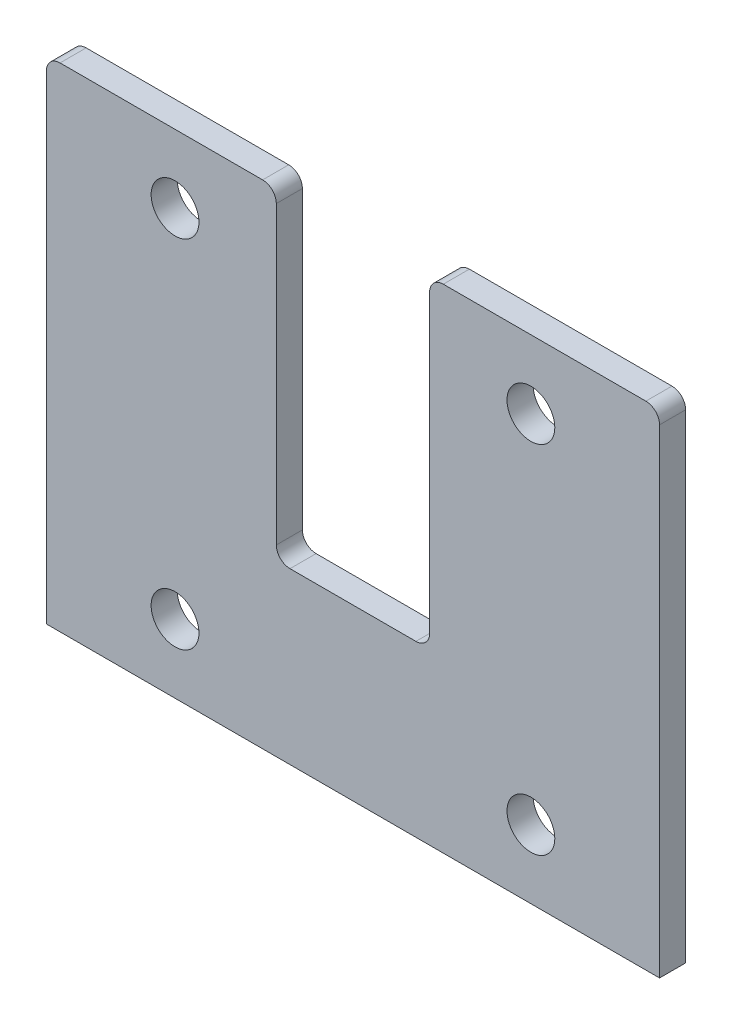
ISO-10303-21;
HEADER;
FILE_DESCRIPTION(('STEP AP214'),'2;1');
FILE_NAME('part.step','',(''),(''),'','','');
FILE_SCHEMA(('AUTOMOTIVE_DESIGN { 1 0 10303 214 1 1 1 1 }'));
ENDSEC;
DATA;
#1=APPLICATION_CONTEXT('core data for automotive mechanical design processes');
#2=APPLICATION_PROTOCOL_DEFINITION('international standard','automotive_design',2000,#1);
#3=PRODUCT_CONTEXT('',#1,'mechanical');
#4=PRODUCT('Part','Part','',(#3));
#5=PRODUCT_RELATED_PRODUCT_CATEGORY('part','',(#4));
#6=PRODUCT_DEFINITION_FORMATION('','',#4);
#7=PRODUCT_DEFINITION_CONTEXT('part definition',#1,'design');
#8=PRODUCT_DEFINITION('design','',#6,#7);
#9=PRODUCT_DEFINITION_SHAPE('','',#8);
#10=(LENGTH_UNIT() NAMED_UNIT(*) SI_UNIT(.MILLI.,.METRE.));
#11=(NAMED_UNIT(*) PLANE_ANGLE_UNIT() SI_UNIT($,.RADIAN.));
#12=(NAMED_UNIT(*) SI_UNIT($,.STERADIAN.) SOLID_ANGLE_UNIT());
#13=UNCERTAINTY_MEASURE_WITH_UNIT(LENGTH_MEASURE(1.E-05),#10,'distance_accuracy_value','');
#14=(GEOMETRIC_REPRESENTATION_CONTEXT(3) GLOBAL_UNCERTAINTY_ASSIGNED_CONTEXT((#13)) GLOBAL_UNIT_ASSIGNED_CONTEXT((#10,
#11,#12)) REPRESENTATION_CONTEXT('',''));
#15=CARTESIAN_POINT('',(0.,0.,0.));
#16=DIRECTION('',(0.,0.,1.));
#17=DIRECTION('',(1.,0.,0.));
#18=AXIS2_PLACEMENT_3D('',#15,#16,#17);
#19=CARTESIAN_POINT('',(0.,0.,9.525));
#20=DIRECTION('',(0.,-1.,0.));
#21=DIRECTION('',(0.,0.,-1.));
#22=AXIS2_PLACEMENT_3D('',#19,#20,#21);
#23=PLANE('',#22);
#24=DIRECTION('',(-1.,0.,0.));
#25=VECTOR('',#24,1.);
#26=CARTESIAN_POINT('',(0.,0.,0.));
#27=LINE('',#26,#25);
#28=CARTESIAN_POINT('',(219.,0.,0.));
#29=VERTEX_POINT('',#28);
#30=CARTESIAN_POINT('',(145.,0.,0.));
#31=VERTEX_POINT('',#30);
#32=EDGE_CURVE('E152',#29,#31,#27,.T.);
#33=ORIENTED_EDGE('',*,*,#32,.T.);
#34=DIRECTION('',(0.,0.,1.));
#35=VECTOR('',#34,1.);
#36=CARTESIAN_POINT('',(145.,0.,9.525));
#37=LINE('',#36,#35);
#38=CARTESIAN_POINT('',(145.,0.,9.525));
#39=VERTEX_POINT('',#38);
#40=EDGE_CURVE('E183',#31,#39,#37,.T.);
#41=ORIENTED_EDGE('',*,*,#40,.T.);
#42=DIRECTION('',(-1.,0.,0.));
#43=VECTOR('',#42,1.);
#44=CARTESIAN_POINT('',(0.,0.,9.525));
#45=LINE('',#44,#43);
#46=CARTESIAN_POINT('',(219.,0.,9.525));
#47=VERTEX_POINT('',#46);
#48=EDGE_CURVE('E171',#47,#39,#45,.T.);
#49=ORIENTED_EDGE('',*,*,#48,.F.);
#50=DIRECTION('',(0.,0.,-1.));
#51=VECTOR('',#50,1.);
#52=CARTESIAN_POINT('',(219.,0.,9.525));
#53=LINE('',#52,#51);
#54=EDGE_CURVE('E180',#47,#29,#53,.T.);
#55=ORIENTED_EDGE('',*,*,#54,.T.);
#56=EDGE_LOOP('',(#33,#41,#49,#55));
#57=FACE_BOUND('',#56,.T.);
#58=ADVANCED_FACE('F35',(#57),#23,.F.);
#59=CARTESIAN_POINT('',(0.,0.,9.525));
#60=DIRECTION('',(1.,0.,0.));
#61=DIRECTION('',(0.,1.,0.));
#62=AXIS2_PLACEMENT_3D('',#59,#60,#61);
#63=PLANE('',#62);
#64=DIRECTION('',(0.,-1.,0.));
#65=VECTOR('',#64,1.);
#66=CARTESIAN_POINT('',(0.,0.,9.525));
#67=LINE('',#66,#65);
#68=CARTESIAN_POINT('',(0.,-5.,9.525));
#69=VERTEX_POINT('',#68);
#70=CARTESIAN_POINT('',(0.,-180.,9.525));
#71=VERTEX_POINT('',#70);
#72=EDGE_CURVE('E138',#69,#71,#67,.T.);
#73=ORIENTED_EDGE('',*,*,#72,.F.);
#74=DIRECTION('',(0.,0.,-1.));
#75=VECTOR('',#74,1.);
#76=CARTESIAN_POINT('',(0.,-5.,9.525));
#77=LINE('',#76,#75);
#78=CARTESIAN_POINT('',(0.,-5.,0.));
#79=VERTEX_POINT('',#78);
#80=EDGE_CURVE('E220',#69,#79,#77,.T.);
#81=ORIENTED_EDGE('',*,*,#80,.T.);
#82=DIRECTION('',(0.,-1.,0.));
#83=VECTOR('',#82,1.);
#84=CARTESIAN_POINT('',(0.,0.,0.));
#85=LINE('',#84,#83);
#86=CARTESIAN_POINT('',(0.,-180.,0.));
#87=VERTEX_POINT('',#86);
#88=EDGE_CURVE('E165',#79,#87,#85,.T.);
#89=ORIENTED_EDGE('',*,*,#88,.T.);
#90=DIRECTION('',(0.,0.,-1.));
#91=VECTOR('',#90,1.);
#92=CARTESIAN_POINT('',(0.,-180.,9.525));
#93=LINE('',#92,#91);
#94=EDGE_CURVE('E157',#71,#87,#93,.T.);
#95=ORIENTED_EDGE('',*,*,#94,.F.);
#96=EDGE_LOOP('',(#73,#81,#89,#95));
#97=FACE_BOUND('',#96,.T.);
#98=ADVANCED_FACE('F163',(#97),#63,.F.);
#99=CARTESIAN_POINT('',(0.,-180.,9.525));
#100=DIRECTION('',(0.,1.,0.));
#101=DIRECTION('',(0.,0.,1.));
#102=AXIS2_PLACEMENT_3D('',#99,#100,#101);
#103=PLANE('',#102);
#104=DIRECTION('',(1.,0.,0.));
#105=VECTOR('',#104,1.);
#106=CARTESIAN_POINT('',(0.,-180.,0.));
#107=LINE('',#106,#105);
#108=CARTESIAN_POINT('',(224.,-180.,0.));
#109=VERTEX_POINT('',#108);
#110=EDGE_CURVE('E261',#87,#109,#107,.T.);
#111=ORIENTED_EDGE('',*,*,#110,.T.);
#112=DIRECTION('',(0.,0.,-1.));
#113=VECTOR('',#112,1.);
#114=CARTESIAN_POINT('',(224.,-180.,9.525));
#115=LINE('',#114,#113);
#116=CARTESIAN_POINT('',(224.,-180.,9.525));
#117=VERTEX_POINT('',#116);
#118=EDGE_CURVE('E159',#117,#109,#115,.T.);
#119=ORIENTED_EDGE('',*,*,#118,.F.);
#120=DIRECTION('',(1.,0.,0.));
#121=VECTOR('',#120,1.);
#122=CARTESIAN_POINT('',(0.,-180.,9.525));
#123=LINE('',#122,#121);
#124=EDGE_CURVE('E143',#71,#117,#123,.T.);
#125=ORIENTED_EDGE('',*,*,#124,.F.);
#126=ORIENTED_EDGE('',*,*,#94,.T.);
#127=EDGE_LOOP('',(#111,#119,#125,#126));
#128=FACE_BOUND('',#127,.T.);
#129=ADVANCED_FACE('F156',(#128),#103,.F.);
#130=CARTESIAN_POINT('',(224.,0.,9.525));
#131=DIRECTION('',(-1.,0.,0.));
#132=DIRECTION('',(0.,-1.,0.));
#133=AXIS2_PLACEMENT_3D('',#130,#131,#132);
#134=PLANE('',#133);
#135=DIRECTION('',(0.,1.,0.));
#136=VECTOR('',#135,1.);
#137=CARTESIAN_POINT('',(224.,0.,0.));
#138=LINE('',#137,#136);
#139=CARTESIAN_POINT('',(224.,-5.,0.));
#140=VERTEX_POINT('',#139);
#141=EDGE_CURVE('E263',#109,#140,#138,.T.);
#142=ORIENTED_EDGE('',*,*,#141,.T.);
#143=DIRECTION('',(0.,0.,-1.));
#144=VECTOR('',#143,1.);
#145=CARTESIAN_POINT('',(224.,-5.,9.525));
#146=LINE('',#145,#144);
#147=CARTESIAN_POINT('',(224.,-5.,9.525));
#148=VERTEX_POINT('',#147);
#149=EDGE_CURVE('E218',#140,#148,#146,.F.);
#150=ORIENTED_EDGE('',*,*,#149,.T.);
#151=DIRECTION('',(0.,1.,0.));
#152=VECTOR('',#151,1.);
#153=CARTESIAN_POINT('',(224.,0.,9.525));
#154=LINE('',#153,#152);
#155=EDGE_CURVE('E161',#117,#148,#154,.T.);
#156=ORIENTED_EDGE('',*,*,#155,.F.);
#157=ORIENTED_EDGE('',*,*,#118,.T.);
#158=EDGE_LOOP('',(#142,#150,#156,#157));
#159=FACE_BOUND('',#158,.T.);
#160=ADVANCED_FACE('F308',(#159),#134,.F.);
#161=CARTESIAN_POINT('',(79.,0.,9.525));
#162=VERTEX_POINT('',#161);
#163=CARTESIAN_POINT('',(5.,0.,9.525));
#164=VERTEX_POINT('',#163);
#165=EDGE_CURVE('E258',#162,#164,#45,.T.);
#166=ORIENTED_EDGE('',*,*,#165,.F.);
#167=DIRECTION('',(0.,0.,1.));
#168=VECTOR('',#167,1.);
#169=CARTESIAN_POINT('',(79.,0.,9.525));
#170=LINE('',#169,#168);
#171=CARTESIAN_POINT('',(79.,0.,0.));
#172=VERTEX_POINT('',#171);
#173=EDGE_CURVE('E211',#162,#172,#170,.F.);
#174=ORIENTED_EDGE('',*,*,#173,.T.);
#175=CARTESIAN_POINT('',(5.,0.,0.));
#176=VERTEX_POINT('',#175);
#177=EDGE_CURVE('E265',#172,#176,#27,.T.);
#178=ORIENTED_EDGE('',*,*,#177,.T.);
#179=DIRECTION('',(0.,0.,-1.));
#180=VECTOR('',#179,1.);
#181=CARTESIAN_POINT('',(5.,0.,9.525));
#182=LINE('',#181,#180);
#183=EDGE_CURVE('E209',#176,#164,#182,.F.);
#184=ORIENTED_EDGE('',*,*,#183,.T.);
#185=EDGE_LOOP('',(#166,#174,#178,#184));
#186=FACE_BOUND('',#185,.T.);
#187=ADVANCED_FACE('F303',(#186),#23,.F.);
#188=CARTESIAN_POINT('',(0.,0.,9.525));
#189=DIRECTION('',(0.,0.,1.));
#190=DIRECTION('',(1.,0.,0.));
#191=AXIS2_PLACEMENT_3D('',#188,#189,#190);
#192=PLANE('',#191);
#193=CARTESIAN_POINT('',(47.,-25.,9.525));
#194=DIRECTION('',(0.,0.,1.));
#195=DIRECTION('',(-1.,0.,0.));
#196=AXIS2_PLACEMENT_3D('',#193,#194,#195);
#197=CIRCLE('',#196,8.73125);
#198=CARTESIAN_POINT('',(55.73125,-25.,9.525));
#199=VERTEX_POINT('',#198);
#200=EDGE_CURVE('E235',#199,#199,#197,.T.);
#201=ORIENTED_EDGE('',*,*,#200,.F.);
#202=EDGE_LOOP('',(#201));
#203=FACE_BOUND('',#202,.T.);
#204=CARTESIAN_POINT('',(47.,-155.,9.525));
#205=DIRECTION('',(0.,0.,1.));
#206=DIRECTION('',(1.,0.,0.));
#207=AXIS2_PLACEMENT_3D('',#204,#205,#206);
#208=CIRCLE('',#207,8.73125);
#209=CARTESIAN_POINT('',(55.73125,-155.,9.525));
#210=VERTEX_POINT('',#209);
#211=EDGE_CURVE('E481',#210,#210,#208,.T.);
#212=ORIENTED_EDGE('',*,*,#211,.F.);
#213=EDGE_LOOP('',(#212));
#214=FACE_BOUND('',#213,.T.);
#215=CARTESIAN_POINT('',(177.,-155.,9.525));
#216=DIRECTION('',(0.,0.,1.));
#217=DIRECTION('',(-1.,0.,0.));
#218=AXIS2_PLACEMENT_3D('',#215,#216,#217);
#219=CIRCLE('',#218,8.73125);
#220=CARTESIAN_POINT('',(185.73125,-155.,9.525));
#221=VERTEX_POINT('',#220);
#222=EDGE_CURVE('E248',#221,#221,#219,.T.);
#223=ORIENTED_EDGE('',*,*,#222,.F.);
#224=EDGE_LOOP('',(#223));
#225=FACE_BOUND('',#224,.T.);
#226=CARTESIAN_POINT('',(177.,-25.,9.525));
#227=DIRECTION('',(0.,0.,1.));
#228=DIRECTION('',(1.,0.,0.));
#229=AXIS2_PLACEMENT_3D('',#226,#227,#228);
#230=CIRCLE('',#229,8.73125);
#231=CARTESIAN_POINT('',(185.73125,-25.,9.525));
#232=VERTEX_POINT('',#231);
#233=EDGE_CURVE('E231',#232,#232,#230,.T.);
#234=ORIENTED_EDGE('',*,*,#233,.F.);
#235=EDGE_LOOP('',(#234));
#236=FACE_BOUND('',#235,.T.);
#237=ORIENTED_EDGE('',*,*,#48,.T.);
#238=CARTESIAN_POINT('',(145.,-5.,9.525));
#239=DIRECTION('',(0.,0.,1.));
#240=DIRECTION('',(1.,0.,0.));
#241=AXIS2_PLACEMENT_3D('',#238,#239,#240);
#242=CIRCLE('',#241,5.);
#243=CARTESIAN_POINT('',(140.,-5.,9.525));
#244=VERTEX_POINT('',#243);
#245=EDGE_CURVE('E191',#39,#244,#242,.T.);
#246=ORIENTED_EDGE('',*,*,#245,.T.);
#247=DIRECTION('',(0.,1.,0.));
#248=VECTOR('',#247,1.);
#249=CARTESIAN_POINT('',(140.,-118.,9.525));
#250=LINE('',#249,#248);
#251=CARTESIAN_POINT('',(140.,-113.,9.525));
#252=VERTEX_POINT('',#251);
#253=EDGE_CURVE('E254',#252,#244,#250,.T.);
#254=ORIENTED_EDGE('',*,*,#253,.F.);
#255=CARTESIAN_POINT('',(135.,-113.,9.525));
#256=DIRECTION('',(0.,0.,1.));
#257=DIRECTION('',(1.,0.,0.));
#258=AXIS2_PLACEMENT_3D('',#255,#256,#257);
#259=CIRCLE('',#258,5.);
#260=CARTESIAN_POINT('',(135.,-118.,9.525));
#261=VERTEX_POINT('',#260);
#262=EDGE_CURVE('E44',#252,#261,#259,.F.);
#263=ORIENTED_EDGE('',*,*,#262,.T.);
#264=DIRECTION('',(1.,0.,0.));
#265=VECTOR('',#264,1.);
#266=CARTESIAN_POINT('',(84.,-118.,9.525));
#267=LINE('',#266,#265);
#268=CARTESIAN_POINT('',(89.,-118.,9.525));
#269=VERTEX_POINT('',#268);
#270=EDGE_CURVE('E251',#269,#261,#267,.T.);
#271=ORIENTED_EDGE('',*,*,#270,.F.);
#272=CARTESIAN_POINT('',(89.,-113.,9.525));
#273=DIRECTION('',(0.,0.,1.));
#274=DIRECTION('',(1.,0.,0.));
#275=AXIS2_PLACEMENT_3D('',#272,#273,#274);
#276=CIRCLE('',#275,5.);
#277=CARTESIAN_POINT('',(84.,-113.,9.525));
#278=VERTEX_POINT('',#277);
#279=EDGE_CURVE('E222',#269,#278,#276,.F.);
#280=ORIENTED_EDGE('',*,*,#279,.T.);
#281=DIRECTION('',(0.,-1.,0.));
#282=VECTOR('',#281,1.);
#283=CARTESIAN_POINT('',(84.,0.,9.525));
#284=LINE('',#283,#282);
#285=CARTESIAN_POINT('',(84.,-5.,9.525));
#286=VERTEX_POINT('',#285);
#287=EDGE_CURVE('E230',#286,#278,#284,.T.);
#288=ORIENTED_EDGE('',*,*,#287,.F.);
#289=CARTESIAN_POINT('',(79.,-5.,9.525));
#290=DIRECTION('',(0.,0.,1.));
#291=DIRECTION('',(1.,0.,0.));
#292=AXIS2_PLACEMENT_3D('',#289,#290,#291);
#293=CIRCLE('',#292,5.);
#294=EDGE_CURVE('E189',#286,#162,#293,.T.);
#295=ORIENTED_EDGE('',*,*,#294,.T.);
#296=ORIENTED_EDGE('',*,*,#165,.T.);
#297=CARTESIAN_POINT('',(5.,-5.,9.525));
#298=DIRECTION('',(0.,0.,1.));
#299=DIRECTION('',(1.,0.,0.));
#300=AXIS2_PLACEMENT_3D('',#297,#298,#299);
#301=CIRCLE('',#300,5.);
#302=EDGE_CURVE('E147',#164,#69,#301,.T.);
#303=ORIENTED_EDGE('',*,*,#302,.T.);
#304=ORIENTED_EDGE('',*,*,#72,.T.);
#305=ORIENTED_EDGE('',*,*,#124,.T.);
#306=ORIENTED_EDGE('',*,*,#155,.T.);
#307=CARTESIAN_POINT('',(219.,-5.,9.525));
#308=DIRECTION('',(0.,0.,1.));
#309=DIRECTION('',(1.,0.,0.));
#310=AXIS2_PLACEMENT_3D('',#307,#308,#309);
#311=CIRCLE('',#310,5.);
#312=EDGE_CURVE('E187',#148,#47,#311,.T.);
#313=ORIENTED_EDGE('',*,*,#312,.T.);
#314=EDGE_LOOP('',(#237,#246,#254,#263,#271,#280,#288,#295,#296,#303,#304,#305,#306,#313));
#315=FACE_BOUND('',#314,.T.);
#316=ADVANCED_FACE('F141',(#203,#214,#225,#236,#315),#192,.T.);
#317=CARTESIAN_POINT('',(0.,0.,0.));
#318=DIRECTION('',(0.,0.,1.));
#319=DIRECTION('',(1.,0.,0.));
#320=AXIS2_PLACEMENT_3D('',#317,#318,#319);
#321=PLANE('',#320);
#322=CARTESIAN_POINT('',(47.,-25.,0.));
#323=DIRECTION('',(0.,0.,1.));
#324=DIRECTION('',(1.,0.,0.));
#325=AXIS2_PLACEMENT_3D('',#322,#323,#324);
#326=CIRCLE('',#325,8.73125);
#327=CARTESIAN_POINT('',(55.73125,-25.,0.));
#328=VERTEX_POINT('',#327);
#329=EDGE_CURVE('E39',#328,#328,#326,.T.);
#330=ORIENTED_EDGE('',*,*,#329,.T.);
#331=EDGE_LOOP('',(#330));
#332=FACE_BOUND('',#331,.T.);
#333=CARTESIAN_POINT('',(47.,-155.,0.));
#334=DIRECTION('',(0.,0.,1.));
#335=DIRECTION('',(1.,0.,0.));
#336=AXIS2_PLACEMENT_3D('',#333,#334,#335);
#337=CIRCLE('',#336,8.73125);
#338=CARTESIAN_POINT('',(55.73125,-155.,0.));
#339=VERTEX_POINT('',#338);
#340=EDGE_CURVE('E234',#339,#339,#337,.T.);
#341=ORIENTED_EDGE('',*,*,#340,.T.);
#342=EDGE_LOOP('',(#341));
#343=FACE_BOUND('',#342,.T.);
#344=CARTESIAN_POINT('',(177.,-155.,0.));
#345=DIRECTION('',(0.,0.,1.));
#346=DIRECTION('',(1.,0.,0.));
#347=AXIS2_PLACEMENT_3D('',#344,#345,#346);
#348=CIRCLE('',#347,8.73125);
#349=CARTESIAN_POINT('',(185.73125,-155.,0.));
#350=VERTEX_POINT('',#349);
#351=EDGE_CURVE('E232',#350,#350,#348,.T.);
#352=ORIENTED_EDGE('',*,*,#351,.T.);
#353=EDGE_LOOP('',(#352));
#354=FACE_BOUND('',#353,.T.);
#355=CARTESIAN_POINT('',(177.,-25.,0.));
#356=DIRECTION('',(0.,0.,1.));
#357=DIRECTION('',(1.,0.,0.));
#358=AXIS2_PLACEMENT_3D('',#355,#356,#357);
#359=CIRCLE('',#358,8.73125);
#360=CARTESIAN_POINT('',(185.73125,-25.,0.));
#361=VERTEX_POINT('',#360);
#362=EDGE_CURVE('E227',#361,#361,#359,.T.);
#363=ORIENTED_EDGE('',*,*,#362,.T.);
#364=EDGE_LOOP('',(#363));
#365=FACE_BOUND('',#364,.T.);
#366=DIRECTION('',(0.,1.,0.));
#367=VECTOR('',#366,1.);
#368=CARTESIAN_POINT('',(140.,0.,0.));
#369=LINE('',#368,#367);
#370=CARTESIAN_POINT('',(140.,-113.,0.));
#371=VERTEX_POINT('',#370);
#372=CARTESIAN_POINT('',(140.,-5.,0.));
#373=VERTEX_POINT('',#372);
#374=EDGE_CURVE('E177',#371,#373,#369,.T.);
#375=ORIENTED_EDGE('',*,*,#374,.T.);
#376=CARTESIAN_POINT('',(145.,-5.,0.));
#377=DIRECTION('',(0.,0.,1.));
#378=DIRECTION('',(1.,0.,0.));
#379=AXIS2_PLACEMENT_3D('',#376,#377,#378);
#380=CIRCLE('',#379,5.);
#381=EDGE_CURVE('E203',#373,#31,#380,.F.);
#382=ORIENTED_EDGE('',*,*,#381,.T.);
#383=ORIENTED_EDGE('',*,*,#32,.F.);
#384=CARTESIAN_POINT('',(219.,-5.,0.));
#385=DIRECTION('',(0.,0.,1.));
#386=DIRECTION('',(1.,0.,0.));
#387=AXIS2_PLACEMENT_3D('',#384,#385,#386);
#388=CIRCLE('',#387,5.);
#389=EDGE_CURVE('E200',#29,#140,#388,.F.);
#390=ORIENTED_EDGE('',*,*,#389,.T.);
#391=ORIENTED_EDGE('',*,*,#141,.F.);
#392=ORIENTED_EDGE('',*,*,#110,.F.);
#393=ORIENTED_EDGE('',*,*,#88,.F.);
#394=CARTESIAN_POINT('',(5.,-5.,0.));
#395=DIRECTION('',(0.,0.,1.));
#396=DIRECTION('',(1.,0.,0.));
#397=AXIS2_PLACEMENT_3D('',#394,#395,#396);
#398=CIRCLE('',#397,5.);
#399=EDGE_CURVE('E198',#79,#176,#398,.F.);
#400=ORIENTED_EDGE('',*,*,#399,.T.);
#401=ORIENTED_EDGE('',*,*,#177,.F.);
#402=CARTESIAN_POINT('',(79.,-5.,0.));
#403=DIRECTION('',(0.,0.,1.));
#404=DIRECTION('',(1.,0.,0.));
#405=AXIS2_PLACEMENT_3D('',#402,#403,#404);
#406=CIRCLE('',#405,5.);
#407=CARTESIAN_POINT('',(84.,-5.,0.));
#408=VERTEX_POINT('',#407);
#409=EDGE_CURVE('E59',#172,#408,#406,.F.);
#410=ORIENTED_EDGE('',*,*,#409,.T.);
#411=DIRECTION('',(0.,-1.,0.));
#412=VECTOR('',#411,1.);
#413=CARTESIAN_POINT('',(84.,0.,0.));
#414=LINE('',#413,#412);
#415=CARTESIAN_POINT('',(84.,-113.,0.));
#416=VERTEX_POINT('',#415);
#417=EDGE_CURVE('E167',#408,#416,#414,.T.);
#418=ORIENTED_EDGE('',*,*,#417,.T.);
#419=CARTESIAN_POINT('',(89.,-113.,0.));
#420=DIRECTION('',(0.,0.,1.));
#421=DIRECTION('',(1.,0.,0.));
#422=AXIS2_PLACEMENT_3D('',#419,#420,#421);
#423=CIRCLE('',#422,5.);
#424=CARTESIAN_POINT('',(89.,-118.,0.));
#425=VERTEX_POINT('',#424);
#426=EDGE_CURVE('E224',#416,#425,#423,.T.);
#427=ORIENTED_EDGE('',*,*,#426,.T.);
#428=DIRECTION('',(1.,0.,0.));
#429=VECTOR('',#428,1.);
#430=CARTESIAN_POINT('',(0.,-118.,0.));
#431=LINE('',#430,#429);
#432=CARTESIAN_POINT('',(135.,-118.,0.));
#433=VERTEX_POINT('',#432);
#434=EDGE_CURVE('E169',#425,#433,#431,.T.);
#435=ORIENTED_EDGE('',*,*,#434,.T.);
#436=CARTESIAN_POINT('',(135.,-113.,0.));
#437=DIRECTION('',(0.,0.,1.));
#438=DIRECTION('',(1.,0.,0.));
#439=AXIS2_PLACEMENT_3D('',#436,#437,#438);
#440=CIRCLE('',#439,5.);
#441=EDGE_CURVE('E11',#433,#371,#440,.T.);
#442=ORIENTED_EDGE('',*,*,#441,.T.);
#443=EDGE_LOOP('',(#375,#382,#383,#390,#391,#392,#393,#400,#401,#410,#418,#427,#435,#442));
#444=FACE_BOUND('',#443,.T.);
#445=ADVANCED_FACE('F305',(#332,#343,#354,#365,#444),#321,.F.);
#446=CARTESIAN_POINT('',(140.,-118.,-3.175));
#447=DIRECTION('',(1.,0.,0.));
#448=DIRECTION('',(0.,0.,-1.));
#449=AXIS2_PLACEMENT_3D('',#446,#447,#448);
#450=PLANE('',#449);
#451=ORIENTED_EDGE('',*,*,#253,.T.);
#452=DIRECTION('',(0.,0.,1.));
#453=VECTOR('',#452,1.);
#454=CARTESIAN_POINT('',(140.,-5.,-3.175));
#455=LINE('',#454,#453);
#456=EDGE_CURVE('E196',#244,#373,#455,.F.);
#457=ORIENTED_EDGE('',*,*,#456,.T.);
#458=ORIENTED_EDGE('',*,*,#374,.F.);
#459=DIRECTION('',(0.,0.,1.));
#460=VECTOR('',#459,1.);
#461=CARTESIAN_POINT('',(140.,-113.,9.525));
#462=LINE('',#461,#460);
#463=EDGE_CURVE('E193',#371,#252,#462,.T.);
#464=ORIENTED_EDGE('',*,*,#463,.T.);
#465=EDGE_LOOP('',(#451,#457,#458,#464));
#466=FACE_BOUND('',#465,.T.);
#467=ADVANCED_FACE('F281',(#466),#450,.F.);
#468=CARTESIAN_POINT('',(84.,-118.,-3.175));
#469=DIRECTION('',(0.,-1.,0.));
#470=DIRECTION('',(0.,0.,-1.));
#471=AXIS2_PLACEMENT_3D('',#468,#469,#470);
#472=PLANE('',#471);
#473=ORIENTED_EDGE('',*,*,#434,.F.);
#474=DIRECTION('',(0.,0.,1.));
#475=VECTOR('',#474,1.);
#476=CARTESIAN_POINT('',(89.,-118.,9.525));
#477=LINE('',#476,#475);
#478=EDGE_CURVE('E215',#425,#269,#477,.T.);
#479=ORIENTED_EDGE('',*,*,#478,.T.);
#480=ORIENTED_EDGE('',*,*,#270,.T.);
#481=DIRECTION('',(0.,0.,1.));
#482=VECTOR('',#481,1.);
#483=CARTESIAN_POINT('',(135.,-118.,0.));
#484=LINE('',#483,#482);
#485=EDGE_CURVE('E213',#261,#433,#484,.F.);
#486=ORIENTED_EDGE('',*,*,#485,.T.);
#487=EDGE_LOOP('',(#473,#479,#480,#486));
#488=FACE_BOUND('',#487,.T.);
#489=ADVANCED_FACE('F291',(#488),#472,.F.);
#490=CARTESIAN_POINT('',(84.,0.,-3.175));
#491=DIRECTION('',(-1.,0.,0.));
#492=DIRECTION('',(0.,-1.,0.));
#493=AXIS2_PLACEMENT_3D('',#490,#491,#492);
#494=PLANE('',#493);
#495=ORIENTED_EDGE('',*,*,#417,.F.);
#496=DIRECTION('',(0.,0.,1.));
#497=VECTOR('',#496,1.);
#498=CARTESIAN_POINT('',(84.,-5.,-3.175));
#499=LINE('',#498,#497);
#500=EDGE_CURVE('E206',#408,#286,#499,.T.);
#501=ORIENTED_EDGE('',*,*,#500,.T.);
#502=ORIENTED_EDGE('',*,*,#287,.T.);
#503=DIRECTION('',(0.,0.,1.));
#504=VECTOR('',#503,1.);
#505=CARTESIAN_POINT('',(84.,-113.,0.));
#506=LINE('',#505,#504);
#507=EDGE_CURVE('E52',#278,#416,#506,.F.);
#508=ORIENTED_EDGE('',*,*,#507,.T.);
#509=EDGE_LOOP('',(#495,#501,#502,#508));
#510=FACE_BOUND('',#509,.T.);
#511=ADVANCED_FACE('F297',(#510),#494,.F.);
#512=CARTESIAN_POINT('',(145.,-5.,9.525));
#513=DIRECTION('',(0.,0.,1.));
#514=DIRECTION('',(1.,0.,0.));
#515=AXIS2_PLACEMENT_3D('',#512,#513,#514);
#516=CYLINDRICAL_SURFACE('',#515,5.);
#517=ORIENTED_EDGE('',*,*,#381,.F.);
#518=ORIENTED_EDGE('',*,*,#456,.F.);
#519=ORIENTED_EDGE('',*,*,#245,.F.);
#520=ORIENTED_EDGE('',*,*,#40,.F.);
#521=EDGE_LOOP('',(#517,#518,#519,#520));
#522=FACE_BOUND('',#521,.T.);
#523=ADVANCED_FACE('F277',(#522),#516,.T.);
#524=CARTESIAN_POINT('',(79.,-5.,-3.175));
#525=DIRECTION('',(0.,0.,1.));
#526=DIRECTION('',(1.,0.,0.));
#527=AXIS2_PLACEMENT_3D('',#524,#525,#526);
#528=CYLINDRICAL_SURFACE('',#527,5.);
#529=ORIENTED_EDGE('',*,*,#409,.F.);
#530=ORIENTED_EDGE('',*,*,#173,.F.);
#531=ORIENTED_EDGE('',*,*,#294,.F.);
#532=ORIENTED_EDGE('',*,*,#500,.F.);
#533=EDGE_LOOP('',(#529,#530,#531,#532));
#534=FACE_BOUND('',#533,.T.);
#535=ADVANCED_FACE('F300',(#534),#528,.T.);
#536=CARTESIAN_POINT('',(89.,-113.,-3.175));
#537=DIRECTION('',(0.,0.,-1.));
#538=DIRECTION('',(-1.,0.,0.));
#539=AXIS2_PLACEMENT_3D('',#536,#537,#538);
#540=CYLINDRICAL_SURFACE('',#539,5.);
#541=ORIENTED_EDGE('',*,*,#426,.F.);
#542=ORIENTED_EDGE('',*,*,#507,.F.);
#543=ORIENTED_EDGE('',*,*,#279,.F.);
#544=ORIENTED_EDGE('',*,*,#478,.F.);
#545=EDGE_LOOP('',(#541,#542,#543,#544));
#546=FACE_BOUND('',#545,.T.);
#547=ADVANCED_FACE('F295',(#546),#540,.F.);
#548=CARTESIAN_POINT('',(135.,-113.,-3.175));
#549=DIRECTION('',(0.,0.,-1.));
#550=DIRECTION('',(-1.,0.,0.));
#551=AXIS2_PLACEMENT_3D('',#548,#549,#550);
#552=CYLINDRICAL_SURFACE('',#551,5.);
#553=ORIENTED_EDGE('',*,*,#441,.F.);
#554=ORIENTED_EDGE('',*,*,#485,.F.);
#555=ORIENTED_EDGE('',*,*,#262,.F.);
#556=ORIENTED_EDGE('',*,*,#463,.F.);
#557=EDGE_LOOP('',(#553,#554,#555,#556));
#558=FACE_BOUND('',#557,.T.);
#559=ADVANCED_FACE('F286',(#558),#552,.F.);
#560=CARTESIAN_POINT('',(219.,-5.,9.525));
#561=DIRECTION('',(0.,0.,-1.));
#562=DIRECTION('',(-1.,0.,0.));
#563=AXIS2_PLACEMENT_3D('',#560,#561,#562);
#564=CYLINDRICAL_SURFACE('',#563,5.);
#565=ORIENTED_EDGE('',*,*,#312,.F.);
#566=ORIENTED_EDGE('',*,*,#149,.F.);
#567=ORIENTED_EDGE('',*,*,#389,.F.);
#568=ORIENTED_EDGE('',*,*,#54,.F.);
#569=EDGE_LOOP('',(#565,#566,#567,#568));
#570=FACE_BOUND('',#569,.T.);
#571=ADVANCED_FACE('F312',(#570),#564,.T.);
#572=CARTESIAN_POINT('',(5.,-5.,9.525));
#573=DIRECTION('',(0.,0.,-1.));
#574=DIRECTION('',(-1.,0.,0.));
#575=AXIS2_PLACEMENT_3D('',#572,#573,#574);
#576=CYLINDRICAL_SURFACE('',#575,5.);
#577=ORIENTED_EDGE('',*,*,#302,.F.);
#578=ORIENTED_EDGE('',*,*,#183,.F.);
#579=ORIENTED_EDGE('',*,*,#399,.F.);
#580=ORIENTED_EDGE('',*,*,#80,.F.);
#581=EDGE_LOOP('',(#577,#578,#579,#580));
#582=FACE_BOUND('',#581,.T.);
#583=ADVANCED_FACE('F37',(#582),#576,.T.);
#584=CARTESIAN_POINT('',(177.,-25.,-3.475));
#585=DIRECTION('',(0.,0.,1.));
#586=DIRECTION('',(1.,0.,0.));
#587=AXIS2_PLACEMENT_3D('',#584,#585,#586);
#588=CYLINDRICAL_SURFACE('',#587,8.73125);
#589=CARTESIAN_POINT('',(185.73125,-25.,9.525));
#590=CARTESIAN_POINT('',(185.73125,-25.,9.42578125));
#591=CARTESIAN_POINT('',(185.73125,-25.,9.3265625));
#592=CARTESIAN_POINT('',(185.73125,-25.,9.128125));
#593=CARTESIAN_POINT('',(185.73125,-25.,9.02890625));
#594=CARTESIAN_POINT('',(185.73125,-25.,8.83046875));
#595=CARTESIAN_POINT('',(185.73125,-25.,8.73125));
#596=CARTESIAN_POINT('',(185.73125,-25.,8.5328125));
#597=CARTESIAN_POINT('',(185.73125,-25.,8.43359375));
#598=CARTESIAN_POINT('',(185.73125,-25.,8.23515625));
#599=CARTESIAN_POINT('',(185.73125,-25.,8.1359375));
#600=CARTESIAN_POINT('',(185.73125,-25.,7.9375));
#601=CARTESIAN_POINT('',(185.73125,-25.,7.83828125));
#602=CARTESIAN_POINT('',(185.73125,-25.,7.63984375));
#603=CARTESIAN_POINT('',(185.73125,-25.,7.540625));
#604=CARTESIAN_POINT('',(185.73125,-25.,7.3421875));
#605=CARTESIAN_POINT('',(185.73125,-25.,7.24296875));
#606=CARTESIAN_POINT('',(185.73125,-25.,7.04453125));
#607=CARTESIAN_POINT('',(185.73125,-25.,6.9453125));
#608=CARTESIAN_POINT('',(185.73125,-25.,6.746875));
#609=CARTESIAN_POINT('',(185.73125,-25.,6.64765625));
#610=CARTESIAN_POINT('',(185.73125,-25.,6.44921875));
#611=CARTESIAN_POINT('',(185.73125,-25.,6.35));
#612=CARTESIAN_POINT('',(185.73125,-25.,6.1515625));
#613=CARTESIAN_POINT('',(185.73125,-25.,6.05234375));
#614=CARTESIAN_POINT('',(185.73125,-25.,5.85390625));
#615=CARTESIAN_POINT('',(185.73125,-25.,5.7546875));
#616=CARTESIAN_POINT('',(185.73125,-25.,5.55625));
#617=CARTESIAN_POINT('',(185.73125,-25.,5.45703125));
#618=CARTESIAN_POINT('',(185.73125,-25.,5.25859375));
#619=CARTESIAN_POINT('',(185.73125,-25.,5.159375));
#620=CARTESIAN_POINT('',(185.73125,-25.,4.9609375));
#621=CARTESIAN_POINT('',(185.73125,-25.,4.86171875));
#622=CARTESIAN_POINT('',(185.73125,-25.,4.66328125));
#623=CARTESIAN_POINT('',(185.73125,-25.,4.5640625));
#624=CARTESIAN_POINT('',(185.73125,-25.,4.365625));
#625=CARTESIAN_POINT('',(185.73125,-25.,4.26640625));
#626=CARTESIAN_POINT('',(185.73125,-25.,4.06796875));
#627=CARTESIAN_POINT('',(185.73125,-25.,3.96875));
#628=CARTESIAN_POINT('',(185.73125,-25.,3.7703125));
#629=CARTESIAN_POINT('',(185.73125,-25.,3.67109375));
#630=CARTESIAN_POINT('',(185.73125,-25.,3.47265625));
#631=CARTESIAN_POINT('',(185.73125,-25.,3.3734375));
#632=CARTESIAN_POINT('',(185.73125,-25.,3.175));
#633=CARTESIAN_POINT('',(185.73125,-25.,3.07578125));
#634=CARTESIAN_POINT('',(185.73125,-25.,2.87734375));
#635=CARTESIAN_POINT('',(185.73125,-25.,2.778125));
#636=CARTESIAN_POINT('',(185.73125,-25.,2.5796875));
#637=CARTESIAN_POINT('',(185.73125,-25.,2.48046875));
#638=CARTESIAN_POINT('',(185.73125,-25.,2.28203125));
#639=CARTESIAN_POINT('',(185.73125,-25.,2.1828125));
#640=CARTESIAN_POINT('',(185.73125,-25.,1.984375));
#641=CARTESIAN_POINT('',(185.73125,-25.,1.88515625));
#642=CARTESIAN_POINT('',(185.73125,-25.,1.68671875));
#643=CARTESIAN_POINT('',(185.73125,-25.,1.5875));
#644=CARTESIAN_POINT('',(185.73125,-25.,1.3890625));
#645=CARTESIAN_POINT('',(185.73125,-25.,1.28984375));
#646=CARTESIAN_POINT('',(185.73125,-25.,1.09140625));
#647=CARTESIAN_POINT('',(185.73125,-25.,0.9921875));
#648=CARTESIAN_POINT('',(185.73125,-25.,0.79375));
#649=CARTESIAN_POINT('',(185.73125,-25.,0.694531249999999));
#650=CARTESIAN_POINT('',(185.73125,-25.,0.49609375));
#651=CARTESIAN_POINT('',(185.73125,-25.,0.396875));
#652=CARTESIAN_POINT('',(185.73125,-25.,0.1984375));
#653=CARTESIAN_POINT('',(185.73125,-25.,0.0992187499999996));
#654=CARTESIAN_POINT('',(185.73125,-25.,0.));
#655=B_SPLINE_CURVE_WITH_KNOTS('',3,(#589,#590,#591,#592,#593,#594,#595,#596,#597,#598,#599,
#600,#601,#602,#603,#604,#605,#606,#607,#608,#609,#610,#611,#612,#613,#614,#615,#616,#617,#618,
#619,#620,#621,#622,#623,#624,#625,#626,#627,#628,#629,#630,#631,#632,#633,#634,#635,#636,#637,
#638,#639,#640,#641,#642,#643,#644,#645,#646,#647,#648,#649,#650,#651,#652,#653,#654),
.UNSPECIFIED.,.F.,.F.,(4,2,2,2,2,2,2,2,2,2,2,2,2,2,2,2,2,2,2,2,2,2,2,2,2,2,2,2,2,2,2,2,4),(0.,
0.29765625,0.5953125,0.892968750000001,1.190625,1.48828125,1.7859375,2.08359375,2.38125,
2.67890625,2.9765625,3.27421875,3.571875,3.86953125,4.1671875,4.46484375,4.7625,5.06015625,
5.3578125,5.65546875,5.953125,6.25078125,6.5484375,6.84609375,7.14375,7.44140625,7.7390625,
8.03671875,8.334375,8.63203125,8.9296875,9.22734375,9.525),.UNSPECIFIED.);
#656=EDGE_CURVE('BSEAM318',#232,#361,#655,.T.);
#657=ORIENTED_EDGE('',*,*,#233,.T.);
#658=ORIENTED_EDGE('',*,*,#362,.F.);
#659=ORIENTED_EDGE('',*,*,#656,.T.);
#660=ORIENTED_EDGE('',*,*,#656,.F.);
#661=EDGE_LOOP('',(#657,#659,#658,#660));
#662=FACE_BOUND('',#661,.T.);
#663=ADVANCED_FACE('F318',(#662),#588,.F.);
#664=CARTESIAN_POINT('',(177.,-155.,-3.475));
#665=DIRECTION('',(0.,0.,1.));
#666=DIRECTION('',(1.,0.,0.));
#667=AXIS2_PLACEMENT_3D('',#664,#665,#666);
#668=CYLINDRICAL_SURFACE('',#667,8.73125);
#669=CARTESIAN_POINT('',(185.73125,-155.,9.525));
#670=CARTESIAN_POINT('',(185.73125,-155.,9.42578125));
#671=CARTESIAN_POINT('',(185.73125,-155.,9.3265625));
#672=CARTESIAN_POINT('',(185.73125,-155.,9.128125));
#673=CARTESIAN_POINT('',(185.73125,-155.,9.02890625));
#674=CARTESIAN_POINT('',(185.73125,-155.,8.83046875));
#675=CARTESIAN_POINT('',(185.73125,-155.,8.73125));
#676=CARTESIAN_POINT('',(185.73125,-155.,8.5328125));
#677=CARTESIAN_POINT('',(185.73125,-155.,8.43359375));
#678=CARTESIAN_POINT('',(185.73125,-155.,8.23515625));
#679=CARTESIAN_POINT('',(185.73125,-155.,8.1359375));
#680=CARTESIAN_POINT('',(185.73125,-155.,7.9375));
#681=CARTESIAN_POINT('',(185.73125,-155.,7.83828125));
#682=CARTESIAN_POINT('',(185.73125,-155.,7.63984375));
#683=CARTESIAN_POINT('',(185.73125,-155.,7.540625));
#684=CARTESIAN_POINT('',(185.73125,-155.,7.3421875));
#685=CARTESIAN_POINT('',(185.73125,-155.,7.24296875));
#686=CARTESIAN_POINT('',(185.73125,-155.,7.04453125));
#687=CARTESIAN_POINT('',(185.73125,-155.,6.9453125));
#688=CARTESIAN_POINT('',(185.73125,-155.,6.746875));
#689=CARTESIAN_POINT('',(185.73125,-155.,6.64765625));
#690=CARTESIAN_POINT('',(185.73125,-155.,6.44921875));
#691=CARTESIAN_POINT('',(185.73125,-155.,6.35));
#692=CARTESIAN_POINT('',(185.73125,-155.,6.1515625));
#693=CARTESIAN_POINT('',(185.73125,-155.,6.05234375));
#694=CARTESIAN_POINT('',(185.73125,-155.,5.85390625));
#695=CARTESIAN_POINT('',(185.73125,-155.,5.7546875));
#696=CARTESIAN_POINT('',(185.73125,-155.,5.55625));
#697=CARTESIAN_POINT('',(185.73125,-155.,5.45703125));
#698=CARTESIAN_POINT('',(185.73125,-155.,5.25859375));
#699=CARTESIAN_POINT('',(185.73125,-155.,5.159375));
#700=CARTESIAN_POINT('',(185.73125,-155.,4.9609375));
#701=CARTESIAN_POINT('',(185.73125,-155.,4.86171875));
#702=CARTESIAN_POINT('',(185.73125,-155.,4.66328125));
#703=CARTESIAN_POINT('',(185.73125,-155.,4.5640625));
#704=CARTESIAN_POINT('',(185.73125,-155.,4.365625));
#705=CARTESIAN_POINT('',(185.73125,-155.,4.26640625));
#706=CARTESIAN_POINT('',(185.73125,-155.,4.06796875));
#707=CARTESIAN_POINT('',(185.73125,-155.,3.96875));
#708=CARTESIAN_POINT('',(185.73125,-155.,3.7703125));
#709=CARTESIAN_POINT('',(185.73125,-155.,3.67109375));
#710=CARTESIAN_POINT('',(185.73125,-155.,3.47265625));
#711=CARTESIAN_POINT('',(185.73125,-155.,3.3734375));
#712=CARTESIAN_POINT('',(185.73125,-155.,3.175));
#713=CARTESIAN_POINT('',(185.73125,-155.,3.07578125));
#714=CARTESIAN_POINT('',(185.73125,-155.,2.87734375));
#715=CARTESIAN_POINT('',(185.73125,-155.,2.778125));
#716=CARTESIAN_POINT('',(185.73125,-155.,2.5796875));
#717=CARTESIAN_POINT('',(185.73125,-155.,2.48046875));
#718=CARTESIAN_POINT('',(185.73125,-155.,2.28203125));
#719=CARTESIAN_POINT('',(185.73125,-155.,2.1828125));
#720=CARTESIAN_POINT('',(185.73125,-155.,1.984375));
#721=CARTESIAN_POINT('',(185.73125,-155.,1.88515625));
#722=CARTESIAN_POINT('',(185.73125,-155.,1.68671875));
#723=CARTESIAN_POINT('',(185.73125,-155.,1.5875));
#724=CARTESIAN_POINT('',(185.73125,-155.,1.3890625));
#725=CARTESIAN_POINT('',(185.73125,-155.,1.28984375));
#726=CARTESIAN_POINT('',(185.73125,-155.,1.09140625));
#727=CARTESIAN_POINT('',(185.73125,-155.,0.9921875));
#728=CARTESIAN_POINT('',(185.73125,-155.,0.79375));
#729=CARTESIAN_POINT('',(185.73125,-155.,0.694531249999999));
#730=CARTESIAN_POINT('',(185.73125,-155.,0.49609375));
#731=CARTESIAN_POINT('',(185.73125,-155.,0.396875));
#732=CARTESIAN_POINT('',(185.73125,-155.,0.1984375));
#733=CARTESIAN_POINT('',(185.73125,-155.,0.0992187499999996));
#734=CARTESIAN_POINT('',(185.73125,-155.,0.));
#735=B_SPLINE_CURVE_WITH_KNOTS('',3,(#669,#670,#671,#672,#673,#674,#675,#676,#677,#678,#679,
#680,#681,#682,#683,#684,#685,#686,#687,#688,#689,#690,#691,#692,#693,#694,#695,#696,#697,#698,
#699,#700,#701,#702,#703,#704,#705,#706,#707,#708,#709,#710,#711,#712,#713,#714,#715,#716,#717,
#718,#719,#720,#721,#722,#723,#724,#725,#726,#727,#728,#729,#730,#731,#732,#733,#734),
.UNSPECIFIED.,.F.,.F.,(4,2,2,2,2,2,2,2,2,2,2,2,2,2,2,2,2,2,2,2,2,2,2,2,2,2,2,2,2,2,2,2,4),(0.,
0.29765625,0.5953125,0.892968750000001,1.190625,1.48828125,1.7859375,2.08359375,2.38125,
2.67890625,2.9765625,3.27421875,3.571875,3.86953125,4.1671875,4.46484375,4.7625,5.06015625,
5.3578125,5.65546875,5.953125,6.25078125,6.5484375,6.84609375,7.14375,7.44140625,7.7390625,
8.03671875,8.334375,8.63203125,8.9296875,9.22734375,9.525),.UNSPECIFIED.);
#736=EDGE_CURVE('BSEAM388',#221,#350,#735,.T.);
#737=ORIENTED_EDGE('',*,*,#222,.T.);
#738=ORIENTED_EDGE('',*,*,#351,.F.);
#739=ORIENTED_EDGE('',*,*,#736,.T.);
#740=ORIENTED_EDGE('',*,*,#736,.F.);
#741=EDGE_LOOP('',(#737,#739,#738,#740));
#742=FACE_BOUND('',#741,.T.);
#743=ADVANCED_FACE('F388',(#742),#668,.F.);
#744=CARTESIAN_POINT('',(47.,-155.,-3.475));
#745=DIRECTION('',(0.,0.,1.));
#746=DIRECTION('',(1.,0.,0.));
#747=AXIS2_PLACEMENT_3D('',#744,#745,#746);
#748=CYLINDRICAL_SURFACE('',#747,8.73125);
#749=CARTESIAN_POINT('',(55.73125,-155.,9.525));
#750=CARTESIAN_POINT('',(55.73125,-155.,9.42578125));
#751=CARTESIAN_POINT('',(55.73125,-155.,9.3265625));
#752=CARTESIAN_POINT('',(55.73125,-155.,9.128125));
#753=CARTESIAN_POINT('',(55.73125,-155.,9.02890625));
#754=CARTESIAN_POINT('',(55.73125,-155.,8.83046875));
#755=CARTESIAN_POINT('',(55.73125,-155.,8.73125));
#756=CARTESIAN_POINT('',(55.73125,-155.,8.5328125));
#757=CARTESIAN_POINT('',(55.73125,-155.,8.43359375));
#758=CARTESIAN_POINT('',(55.73125,-155.,8.23515625));
#759=CARTESIAN_POINT('',(55.73125,-155.,8.1359375));
#760=CARTESIAN_POINT('',(55.73125,-155.,7.9375));
#761=CARTESIAN_POINT('',(55.73125,-155.,7.83828125));
#762=CARTESIAN_POINT('',(55.73125,-155.,7.63984375));
#763=CARTESIAN_POINT('',(55.73125,-155.,7.540625));
#764=CARTESIAN_POINT('',(55.73125,-155.,7.3421875));
#765=CARTESIAN_POINT('',(55.73125,-155.,7.24296875));
#766=CARTESIAN_POINT('',(55.73125,-155.,7.04453125));
#767=CARTESIAN_POINT('',(55.73125,-155.,6.9453125));
#768=CARTESIAN_POINT('',(55.73125,-155.,6.746875));
#769=CARTESIAN_POINT('',(55.73125,-155.,6.64765625));
#770=CARTESIAN_POINT('',(55.73125,-155.,6.44921875));
#771=CARTESIAN_POINT('',(55.73125,-155.,6.35));
#772=CARTESIAN_POINT('',(55.73125,-155.,6.1515625));
#773=CARTESIAN_POINT('',(55.73125,-155.,6.05234375));
#774=CARTESIAN_POINT('',(55.73125,-155.,5.85390625));
#775=CARTESIAN_POINT('',(55.73125,-155.,5.7546875));
#776=CARTESIAN_POINT('',(55.73125,-155.,5.55625));
#777=CARTESIAN_POINT('',(55.73125,-155.,5.45703125));
#778=CARTESIAN_POINT('',(55.73125,-155.,5.25859375));
#779=CARTESIAN_POINT('',(55.73125,-155.,5.159375));
#780=CARTESIAN_POINT('',(55.73125,-155.,4.9609375));
#781=CARTESIAN_POINT('',(55.73125,-155.,4.86171875));
#782=CARTESIAN_POINT('',(55.73125,-155.,4.66328125));
#783=CARTESIAN_POINT('',(55.73125,-155.,4.5640625));
#784=CARTESIAN_POINT('',(55.73125,-155.,4.365625));
#785=CARTESIAN_POINT('',(55.73125,-155.,4.26640625));
#786=CARTESIAN_POINT('',(55.73125,-155.,4.06796875));
#787=CARTESIAN_POINT('',(55.73125,-155.,3.96875));
#788=CARTESIAN_POINT('',(55.73125,-155.,3.7703125));
#789=CARTESIAN_POINT('',(55.73125,-155.,3.67109375));
#790=CARTESIAN_POINT('',(55.73125,-155.,3.47265625));
#791=CARTESIAN_POINT('',(55.73125,-155.,3.3734375));
#792=CARTESIAN_POINT('',(55.73125,-155.,3.175));
#793=CARTESIAN_POINT('',(55.73125,-155.,3.07578125));
#794=CARTESIAN_POINT('',(55.73125,-155.,2.87734375));
#795=CARTESIAN_POINT('',(55.73125,-155.,2.778125));
#796=CARTESIAN_POINT('',(55.73125,-155.,2.5796875));
#797=CARTESIAN_POINT('',(55.73125,-155.,2.48046875));
#798=CARTESIAN_POINT('',(55.73125,-155.,2.28203125));
#799=CARTESIAN_POINT('',(55.73125,-155.,2.1828125));
#800=CARTESIAN_POINT('',(55.73125,-155.,1.984375));
#801=CARTESIAN_POINT('',(55.73125,-155.,1.88515625));
#802=CARTESIAN_POINT('',(55.73125,-155.,1.68671875));
#803=CARTESIAN_POINT('',(55.73125,-155.,1.5875));
#804=CARTESIAN_POINT('',(55.73125,-155.,1.3890625));
#805=CARTESIAN_POINT('',(55.73125,-155.,1.28984375));
#806=CARTESIAN_POINT('',(55.73125,-155.,1.09140625));
#807=CARTESIAN_POINT('',(55.73125,-155.,0.9921875));
#808=CARTESIAN_POINT('',(55.73125,-155.,0.79375));
#809=CARTESIAN_POINT('',(55.73125,-155.,0.694531249999999));
#810=CARTESIAN_POINT('',(55.73125,-155.,0.49609375));
#811=CARTESIAN_POINT('',(55.73125,-155.,0.396875));
#812=CARTESIAN_POINT('',(55.73125,-155.,0.1984375));
#813=CARTESIAN_POINT('',(55.73125,-155.,0.0992187499999996));
#814=CARTESIAN_POINT('',(55.73125,-155.,0.));
#815=B_SPLINE_CURVE_WITH_KNOTS('',3,(#749,#750,#751,#752,#753,#754,#755,#756,#757,#758,#759,
#760,#761,#762,#763,#764,#765,#766,#767,#768,#769,#770,#771,#772,#773,#774,#775,#776,#777,#778,
#779,#780,#781,#782,#783,#784,#785,#786,#787,#788,#789,#790,#791,#792,#793,#794,#795,#796,#797,
#798,#799,#800,#801,#802,#803,#804,#805,#806,#807,#808,#809,#810,#811,#812,#813,#814),
.UNSPECIFIED.,.F.,.F.,(4,2,2,2,2,2,2,2,2,2,2,2,2,2,2,2,2,2,2,2,2,2,2,2,2,2,2,2,2,2,2,2,4),(0.,
0.29765625,0.5953125,0.892968750000001,1.190625,1.48828125,1.7859375,2.08359375,2.38125,
2.67890625,2.9765625,3.27421875,3.571875,3.86953125,4.1671875,4.46484375,4.7625,5.06015625,
5.3578125,5.65546875,5.953125,6.25078125,6.5484375,6.84609375,7.14375,7.44140625,7.7390625,
8.03671875,8.334375,8.63203125,8.9296875,9.22734375,9.525),.UNSPECIFIED.);
#816=EDGE_CURVE('BSEAM397',#210,#339,#815,.T.);
#817=ORIENTED_EDGE('',*,*,#211,.T.);
#818=ORIENTED_EDGE('',*,*,#340,.F.);
#819=ORIENTED_EDGE('',*,*,#816,.T.);
#820=ORIENTED_EDGE('',*,*,#816,.F.);
#821=EDGE_LOOP('',(#817,#819,#818,#820));
#822=FACE_BOUND('',#821,.T.);
#823=ADVANCED_FACE('F397',(#822),#748,.F.);
#824=CARTESIAN_POINT('',(47.,-25.,-3.475));
#825=DIRECTION('',(0.,0.,1.));
#826=DIRECTION('',(1.,0.,0.));
#827=AXIS2_PLACEMENT_3D('',#824,#825,#826);
#828=CYLINDRICAL_SURFACE('',#827,8.73125);
#829=CARTESIAN_POINT('',(55.73125,-25.,9.525));
#830=CARTESIAN_POINT('',(55.73125,-25.,9.42578125));
#831=CARTESIAN_POINT('',(55.73125,-25.,9.3265625));
#832=CARTESIAN_POINT('',(55.73125,-25.,9.128125));
#833=CARTESIAN_POINT('',(55.73125,-25.,9.02890625));
#834=CARTESIAN_POINT('',(55.73125,-25.,8.83046875));
#835=CARTESIAN_POINT('',(55.73125,-25.,8.73125));
#836=CARTESIAN_POINT('',(55.73125,-25.,8.5328125));
#837=CARTESIAN_POINT('',(55.73125,-25.,8.43359375));
#838=CARTESIAN_POINT('',(55.73125,-25.,8.23515625));
#839=CARTESIAN_POINT('',(55.73125,-25.,8.1359375));
#840=CARTESIAN_POINT('',(55.73125,-25.,7.9375));
#841=CARTESIAN_POINT('',(55.73125,-25.,7.83828125));
#842=CARTESIAN_POINT('',(55.73125,-25.,7.63984375));
#843=CARTESIAN_POINT('',(55.73125,-25.,7.540625));
#844=CARTESIAN_POINT('',(55.73125,-25.,7.3421875));
#845=CARTESIAN_POINT('',(55.73125,-25.,7.24296875));
#846=CARTESIAN_POINT('',(55.73125,-25.,7.04453125));
#847=CARTESIAN_POINT('',(55.73125,-25.,6.9453125));
#848=CARTESIAN_POINT('',(55.73125,-25.,6.746875));
#849=CARTESIAN_POINT('',(55.73125,-25.,6.64765625));
#850=CARTESIAN_POINT('',(55.73125,-25.,6.44921875));
#851=CARTESIAN_POINT('',(55.73125,-25.,6.35));
#852=CARTESIAN_POINT('',(55.73125,-25.,6.1515625));
#853=CARTESIAN_POINT('',(55.73125,-25.,6.05234375));
#854=CARTESIAN_POINT('',(55.73125,-25.,5.85390625));
#855=CARTESIAN_POINT('',(55.73125,-25.,5.7546875));
#856=CARTESIAN_POINT('',(55.73125,-25.,5.55625));
#857=CARTESIAN_POINT('',(55.73125,-25.,5.45703125));
#858=CARTESIAN_POINT('',(55.73125,-25.,5.25859375));
#859=CARTESIAN_POINT('',(55.73125,-25.,5.159375));
#860=CARTESIAN_POINT('',(55.73125,-25.,4.9609375));
#861=CARTESIAN_POINT('',(55.73125,-25.,4.86171875));
#862=CARTESIAN_POINT('',(55.73125,-25.,4.66328125));
#863=CARTESIAN_POINT('',(55.73125,-25.,4.5640625));
#864=CARTESIAN_POINT('',(55.73125,-25.,4.365625));
#865=CARTESIAN_POINT('',(55.73125,-25.,4.26640625));
#866=CARTESIAN_POINT('',(55.73125,-25.,4.06796875));
#867=CARTESIAN_POINT('',(55.73125,-25.,3.96875));
#868=CARTESIAN_POINT('',(55.73125,-25.,3.7703125));
#869=CARTESIAN_POINT('',(55.73125,-25.,3.67109375));
#870=CARTESIAN_POINT('',(55.73125,-25.,3.47265625));
#871=CARTESIAN_POINT('',(55.73125,-25.,3.3734375));
#872=CARTESIAN_POINT('',(55.73125,-25.,3.175));
#873=CARTESIAN_POINT('',(55.73125,-25.,3.07578125));
#874=CARTESIAN_POINT('',(55.73125,-25.,2.87734375));
#875=CARTESIAN_POINT('',(55.73125,-25.,2.778125));
#876=CARTESIAN_POINT('',(55.73125,-25.,2.5796875));
#877=CARTESIAN_POINT('',(55.73125,-25.,2.48046875));
#878=CARTESIAN_POINT('',(55.73125,-25.,2.28203125));
#879=CARTESIAN_POINT('',(55.73125,-25.,2.1828125));
#880=CARTESIAN_POINT('',(55.73125,-25.,1.984375));
#881=CARTESIAN_POINT('',(55.73125,-25.,1.88515625));
#882=CARTESIAN_POINT('',(55.73125,-25.,1.68671875));
#883=CARTESIAN_POINT('',(55.73125,-25.,1.5875));
#884=CARTESIAN_POINT('',(55.73125,-25.,1.3890625));
#885=CARTESIAN_POINT('',(55.73125,-25.,1.28984375));
#886=CARTESIAN_POINT('',(55.73125,-25.,1.09140625));
#887=CARTESIAN_POINT('',(55.73125,-25.,0.9921875));
#888=CARTESIAN_POINT('',(55.73125,-25.,0.79375));
#889=CARTESIAN_POINT('',(55.73125,-25.,0.694531249999999));
#890=CARTESIAN_POINT('',(55.73125,-25.,0.49609375));
#891=CARTESIAN_POINT('',(55.73125,-25.,0.396875));
#892=CARTESIAN_POINT('',(55.73125,-25.,0.1984375));
#893=CARTESIAN_POINT('',(55.73125,-25.,0.0992187499999996));
#894=CARTESIAN_POINT('',(55.73125,-25.,0.));
#895=B_SPLINE_CURVE_WITH_KNOTS('',3,(#829,#830,#831,#832,#833,#834,#835,#836,#837,#838,#839,
#840,#841,#842,#843,#844,#845,#846,#847,#848,#849,#850,#851,#852,#853,#854,#855,#856,#857,#858,
#859,#860,#861,#862,#863,#864,#865,#866,#867,#868,#869,#870,#871,#872,#873,#874,#875,#876,#877,
#878,#879,#880,#881,#882,#883,#884,#885,#886,#887,#888,#889,#890,#891,#892,#893,#894),
.UNSPECIFIED.,.F.,.F.,(4,2,2,2,2,2,2,2,2,2,2,2,2,2,2,2,2,2,2,2,2,2,2,2,2,2,2,2,2,2,2,2,4),(0.,
0.29765625,0.5953125,0.892968750000001,1.190625,1.48828125,1.7859375,2.08359375,2.38125,
2.67890625,2.9765625,3.27421875,3.571875,3.86953125,4.1671875,4.46484375,4.7625,5.06015625,
5.3578125,5.65546875,5.953125,6.25078125,6.5484375,6.84609375,7.14375,7.44140625,7.7390625,
8.03671875,8.334375,8.63203125,8.9296875,9.22734375,9.525),.UNSPECIFIED.);
#896=EDGE_CURVE('BSEAM407',#199,#328,#895,.T.);
#897=ORIENTED_EDGE('',*,*,#200,.T.);
#898=ORIENTED_EDGE('',*,*,#329,.F.);
#899=ORIENTED_EDGE('',*,*,#896,.T.);
#900=ORIENTED_EDGE('',*,*,#896,.F.);
#901=EDGE_LOOP('',(#897,#899,#898,#900));
#902=FACE_BOUND('',#901,.T.);
#903=ADVANCED_FACE('F407',(#902),#828,.F.);
#904=CLOSED_SHELL('',(#58,#98,#129,#160,#187,#316,#445,#467,#489,#511,#523,#535,#547,#559,#571,
#583,#663,#743,#823,#903));
#905=MANIFOLD_SOLID_BREP('B2',#904);
#906=ADVANCED_BREP_SHAPE_REPRESENTATION('',(#18,#905),#14);
#907=SHAPE_DEFINITION_REPRESENTATION(#9,#906);
ENDSEC;
END-ISO-10303-21;
